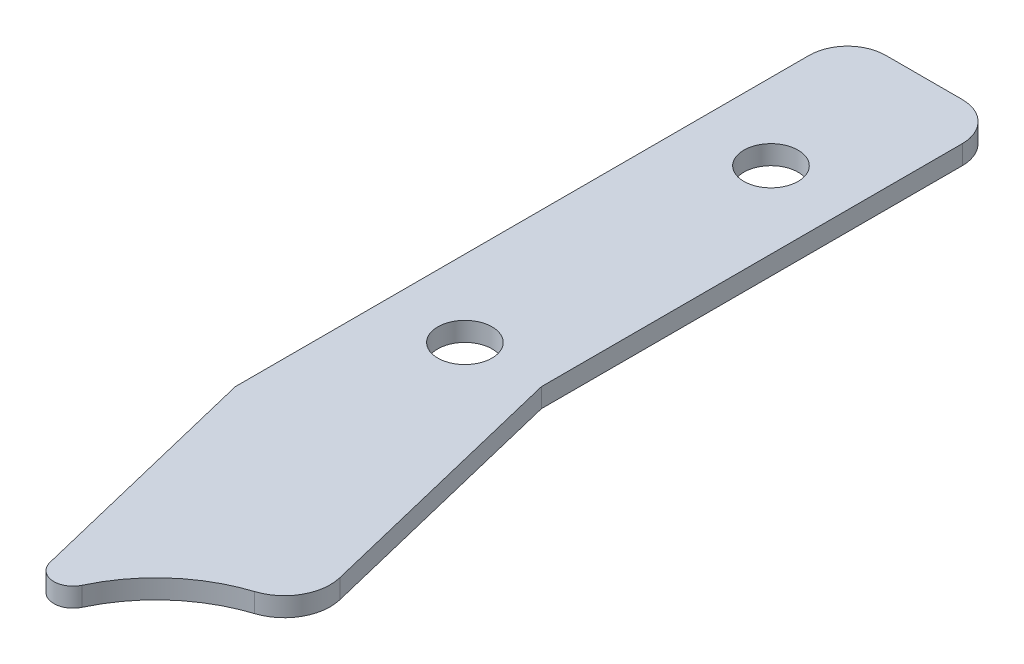
ISO-10303-21;
HEADER;
FILE_DESCRIPTION(('STEP AP214'),'2;1');
FILE_NAME('part.step','',(''),(''),'','','');
FILE_SCHEMA(('AUTOMOTIVE_DESIGN { 1 0 10303 214 1 1 1 1 }'));
ENDSEC;
DATA;
#1=APPLICATION_CONTEXT('core data for automotive mechanical design processes');
#2=APPLICATION_PROTOCOL_DEFINITION('international standard','automotive_design',2000,#1);
#3=PRODUCT_CONTEXT('',#1,'mechanical');
#4=PRODUCT('Part','Part','',(#3));
#5=PRODUCT_RELATED_PRODUCT_CATEGORY('part','',(#4));
#6=PRODUCT_DEFINITION_FORMATION('','',#4);
#7=PRODUCT_DEFINITION_CONTEXT('part definition',#1,'design');
#8=PRODUCT_DEFINITION('design','',#6,#7);
#9=PRODUCT_DEFINITION_SHAPE('','',#8);
#10=(LENGTH_UNIT() NAMED_UNIT(*) SI_UNIT(.MILLI.,.METRE.));
#11=(NAMED_UNIT(*) PLANE_ANGLE_UNIT() SI_UNIT($,.RADIAN.));
#12=(NAMED_UNIT(*) SI_UNIT($,.STERADIAN.) SOLID_ANGLE_UNIT());
#13=UNCERTAINTY_MEASURE_WITH_UNIT(LENGTH_MEASURE(1.E-05),#10,'distance_accuracy_value','');
#14=(GEOMETRIC_REPRESENTATION_CONTEXT(3) GLOBAL_UNCERTAINTY_ASSIGNED_CONTEXT((#13)) GLOBAL_UNIT_ASSIGNED_CONTEXT((#10,
#11,#12)) REPRESENTATION_CONTEXT('',''));
#15=CARTESIAN_POINT('',(0.,0.,0.));
#16=DIRECTION('',(0.,0.,1.));
#17=DIRECTION('',(1.,0.,0.));
#18=AXIS2_PLACEMENT_3D('',#15,#16,#17);
#19=CARTESIAN_POINT('',(-232.560065736467,1.5875,56.4897882656069));
#20=DIRECTION('',(-0.971743243518999,0.,0.236040396278211));
#21=DIRECTION('',(0.236040396278211,0.,0.971743243518999));
#22=AXIS2_PLACEMENT_3D('',#19,#20,#21);
#23=PLANE('',#22);
#24=DIRECTION('',(-0.236040396278211,0.,-0.971743243518999));
#25=VECTOR('',#24,1.);
#26=CARTESIAN_POINT('',(-232.560065736467,1.5875,56.4897882656069));
#27=LINE('',#26,#25);
#28=CARTESIAN_POINT('',(-229.439778952757,1.5875,69.3355453805772));
#29=VERTEX_POINT('',#28);
#30=CARTESIAN_POINT('',(-234.808335869759,1.5875,47.233994146971));
#31=VERTEX_POINT('',#30);
#32=EDGE_CURVE('E111',#29,#31,#27,.T.);
#33=ORIENTED_EDGE('',*,*,#32,.F.);
#34=DIRECTION('',(0.,-1.,0.));
#35=VECTOR('',#34,1.);
#36=CARTESIAN_POINT('',(-229.439778952757,1.5875,69.3355453805772));
#37=LINE('',#36,#35);
#38=CARTESIAN_POINT('',(-229.439778952757,0.,69.3355453805772));
#39=VERTEX_POINT('',#38);
#40=EDGE_CURVE('E136',#29,#39,#37,.T.);
#41=ORIENTED_EDGE('',*,*,#40,.T.);
#42=DIRECTION('',(-0.236040396278211,0.,-0.971743243518999));
#43=VECTOR('',#42,1.);
#44=CARTESIAN_POINT('',(-232.560065736467,0.,56.4897882656069));
#45=LINE('',#44,#43);
#46=CARTESIAN_POINT('',(-234.808335869759,0.,47.233994146971));
#47=VERTEX_POINT('',#46);
#48=EDGE_CURVE('E134',#39,#47,#45,.T.);
#49=ORIENTED_EDGE('',*,*,#48,.T.);
#50=DIRECTION('',(0.,-1.,0.));
#51=VECTOR('',#50,1.);
#52=CARTESIAN_POINT('',(-234.808335869759,1.5875,47.233994146971));
#53=LINE('',#52,#51);
#54=EDGE_CURVE('E127',#31,#47,#53,.T.);
#55=ORIENTED_EDGE('',*,*,#54,.F.);
#56=EDGE_LOOP('',(#33,#41,#49,#55));
#57=FACE_BOUND('',#56,.T.);
#58=ADVANCED_FACE('F35',(#57),#23,.F.);
#59=CARTESIAN_POINT('',(-234.808335869759,1.5875,0.));
#60=DIRECTION('',(-1.,0.,0.));
#61=DIRECTION('',(0.,0.,1.));
#62=AXIS2_PLACEMENT_3D('',#59,#60,#61);
#63=PLANE('',#62);
#64=DIRECTION('',(0.,0.,-1.));
#65=VECTOR('',#64,1.);
#66=CARTESIAN_POINT('',(-234.808335869759,0.,0.));
#67=LINE('',#66,#65);
#68=CARTESIAN_POINT('',(-234.808335869759,0.,12.3089941469709));
#69=VERTEX_POINT('',#68);
#70=EDGE_CURVE('E230',#47,#69,#67,.T.);
#71=ORIENTED_EDGE('',*,*,#70,.T.);
#72=DIRECTION('',(0.,-1.,0.));
#73=VECTOR('',#72,1.);
#74=CARTESIAN_POINT('',(-234.808335869759,1.5875,12.3089941469709));
#75=LINE('',#74,#73);
#76=CARTESIAN_POINT('',(-234.808335869759,1.5875,12.3089941469709));
#77=VERTEX_POINT('',#76);
#78=EDGE_CURVE('E129',#77,#69,#75,.T.);
#79=ORIENTED_EDGE('',*,*,#78,.F.);
#80=DIRECTION('',(0.,0.,-1.));
#81=VECTOR('',#80,1.);
#82=CARTESIAN_POINT('',(-234.808335869759,1.5875,0.));
#83=LINE('',#82,#81);
#84=EDGE_CURVE('E114',#31,#77,#83,.T.);
#85=ORIENTED_EDGE('',*,*,#84,.F.);
#86=ORIENTED_EDGE('',*,*,#54,.T.);
#87=EDGE_LOOP('',(#71,#79,#85,#86));
#88=FACE_BOUND('',#87,.T.);
#89=ADVANCED_FACE('F126',(#88),#63,.F.);
#90=CARTESIAN_POINT('',(-237.983335869759,1.5875,12.3089941469709));
#91=DIRECTION('',(0.,-1.,0.));
#92=DIRECTION('',(0.,0.,-1.));
#93=AXIS2_PLACEMENT_3D('',#90,#91,#92);
#94=CYLINDRICAL_SURFACE('',#93,3.17499999999999);
#95=CARTESIAN_POINT('',(-237.983335869759,0.,12.3089941469709));
#96=DIRECTION('',(0.,1.,0.));
#97=DIRECTION('',(0.,0.,1.));
#98=AXIS2_PLACEMENT_3D('',#95,#96,#97);
#99=CIRCLE('',#98,3.17499999999999);
#100=CARTESIAN_POINT('',(-237.983335869759,0.,9.13399414697094));
#101=VERTEX_POINT('',#100);
#102=EDGE_CURVE('E231',#69,#101,#99,.T.);
#103=ORIENTED_EDGE('',*,*,#102,.T.);
#104=DIRECTION('',(0.,-1.,0.));
#105=VECTOR('',#104,1.);
#106=CARTESIAN_POINT('',(-237.983335869759,1.5875,9.13399414697094));
#107=LINE('',#106,#105);
#108=CARTESIAN_POINT('',(-237.983335869759,1.5875,9.13399414697094));
#109=VERTEX_POINT('',#108);
#110=EDGE_CURVE('E140',#109,#101,#107,.T.);
#111=ORIENTED_EDGE('',*,*,#110,.F.);
#112=CARTESIAN_POINT('',(-237.983335869759,1.5875,12.3089941469709));
#113=DIRECTION('',(0.,1.,0.));
#114=DIRECTION('',(0.,0.,1.));
#115=AXIS2_PLACEMENT_3D('',#112,#113,#114);
#116=CIRCLE('',#115,3.17499999999999);
#117=EDGE_CURVE('E131',#77,#109,#116,.T.);
#118=ORIENTED_EDGE('',*,*,#117,.F.);
#119=ORIENTED_EDGE('',*,*,#78,.T.);
#120=EDGE_LOOP('',(#103,#111,#118,#119));
#121=FACE_BOUND('',#120,.T.);
#122=ADVANCED_FACE('F210',(#121),#94,.T.);
#123=CARTESIAN_POINT('',(0.,1.5875,9.13399414697113));
#124=DIRECTION('',(0.,0.,1.));
#125=DIRECTION('',(1.,0.,0.));
#126=AXIS2_PLACEMENT_3D('',#123,#124,#125);
#127=PLANE('',#126);
#128=DIRECTION('',(-1.,0.,0.));
#129=VECTOR('',#128,1.);
#130=CARTESIAN_POINT('',(0.,0.,9.13399414697113));
#131=LINE('',#130,#129);
#132=CARTESIAN_POINT('',(-244.333335869759,0.,9.13399414697093));
#133=VERTEX_POINT('',#132);
#134=EDGE_CURVE('E232',#101,#133,#131,.T.);
#135=ORIENTED_EDGE('',*,*,#134,.T.);
#136=DIRECTION('',(0.,-1.,0.));
#137=VECTOR('',#136,1.);
#138=CARTESIAN_POINT('',(-244.333335869759,1.5875,9.13399414697093));
#139=LINE('',#138,#137);
#140=CARTESIAN_POINT('',(-244.333335869759,1.5875,9.13399414697093));
#141=VERTEX_POINT('',#140);
#142=EDGE_CURVE('E254',#141,#133,#139,.T.);
#143=ORIENTED_EDGE('',*,*,#142,.F.);
#144=DIRECTION('',(-1.,0.,0.));
#145=VECTOR('',#144,1.);
#146=CARTESIAN_POINT('',(0.,1.5875,9.13399414697113));
#147=LINE('',#146,#145);
#148=EDGE_CURVE('E169',#109,#141,#147,.T.);
#149=ORIENTED_EDGE('',*,*,#148,.F.);
#150=ORIENTED_EDGE('',*,*,#110,.T.);
#151=EDGE_LOOP('',(#135,#143,#149,#150));
#152=FACE_BOUND('',#151,.T.);
#153=ADVANCED_FACE('F206',(#152),#127,.F.);
#154=CARTESIAN_POINT('',(-244.333335869759,1.5875,12.3089941469709));
#155=DIRECTION('',(0.,-1.,0.));
#156=DIRECTION('',(0.,0.,-1.));
#157=AXIS2_PLACEMENT_3D('',#154,#155,#156);
#158=CYLINDRICAL_SURFACE('',#157,3.17500000000001);
#159=CARTESIAN_POINT('',(-244.333335869759,0.,12.3089941469709));
#160=DIRECTION('',(0.,1.,0.));
#161=DIRECTION('',(0.,0.,1.));
#162=AXIS2_PLACEMENT_3D('',#159,#160,#161);
#163=CIRCLE('',#162,3.17500000000001);
#164=CARTESIAN_POINT('',(-247.508335869759,0.,12.3089941469709));
#165=VERTEX_POINT('',#164);
#166=EDGE_CURVE('E236',#133,#165,#163,.T.);
#167=ORIENTED_EDGE('',*,*,#166,.T.);
#168=DIRECTION('',(0.,-1.,0.));
#169=VECTOR('',#168,1.);
#170=CARTESIAN_POINT('',(-247.508335869759,1.5875,12.3089941469709));
#171=LINE('',#170,#169);
#172=CARTESIAN_POINT('',(-247.508335869759,1.5875,12.3089941469709));
#173=VERTEX_POINT('',#172);
#174=EDGE_CURVE('E251',#173,#165,#171,.T.);
#175=ORIENTED_EDGE('',*,*,#174,.F.);
#176=CARTESIAN_POINT('',(-244.333335869759,1.5875,12.3089941469709));
#177=DIRECTION('',(0.,1.,0.));
#178=DIRECTION('',(0.,0.,1.));
#179=AXIS2_PLACEMENT_3D('',#176,#177,#178);
#180=CIRCLE('',#179,3.17500000000001);
#181=EDGE_CURVE('E171',#141,#173,#180,.T.);
#182=ORIENTED_EDGE('',*,*,#181,.F.);
#183=ORIENTED_EDGE('',*,*,#142,.T.);
#184=EDGE_LOOP('',(#167,#175,#182,#183));
#185=FACE_BOUND('',#184,.T.);
#186=ADVANCED_FACE('F202',(#185),#158,.T.);
#187=CARTESIAN_POINT('',(-247.508335869759,1.5875,0.));
#188=DIRECTION('',(1.,0.,0.));
#189=DIRECTION('',(0.,0.,-1.));
#190=AXIS2_PLACEMENT_3D('',#187,#188,#189);
#191=PLANE('',#190);
#192=DIRECTION('',(0.,0.,1.));
#193=VECTOR('',#192,1.);
#194=CARTESIAN_POINT('',(-247.508335869759,0.,0.));
#195=LINE('',#194,#193);
#196=CARTESIAN_POINT('',(-247.508335869759,0.,59.933994146971));
#197=VERTEX_POINT('',#196);
#198=EDGE_CURVE('E238',#165,#197,#195,.T.);
#199=ORIENTED_EDGE('',*,*,#198,.T.);
#200=DIRECTION('',(0.,-1.,0.));
#201=VECTOR('',#200,1.);
#202=CARTESIAN_POINT('',(-247.508335869759,1.5875,59.933994146971));
#203=LINE('',#202,#201);
#204=CARTESIAN_POINT('',(-247.508335869759,1.5875,59.933994146971));
#205=VERTEX_POINT('',#204);
#206=EDGE_CURVE('E183',#205,#197,#203,.T.);
#207=ORIENTED_EDGE('',*,*,#206,.F.);
#208=DIRECTION('',(0.,0.,1.));
#209=VECTOR('',#208,1.);
#210=CARTESIAN_POINT('',(-247.508335869759,1.5875,0.));
#211=LINE('',#210,#209);
#212=EDGE_CURVE('E173',#173,#205,#211,.T.);
#213=ORIENTED_EDGE('',*,*,#212,.F.);
#214=ORIENTED_EDGE('',*,*,#174,.T.);
#215=EDGE_LOOP('',(#199,#207,#213,#214));
#216=FACE_BOUND('',#215,.T.);
#217=ADVANCED_FACE('F199',(#216),#191,.F.);
#218=CARTESIAN_POINT('',(-247.465491749859,1.5875,60.1103770233491));
#219=DIRECTION('',(-0.971743243518999,0.,0.236040396278211));
#220=DIRECTION('',(0.236040396278211,0.,0.971743243518999));
#221=AXIS2_PLACEMENT_3D('',#218,#219,#220);
#222=PLANE('',#221);
#223=DIRECTION('',(-0.236040396278211,0.,-0.971743243518999));
#224=VECTOR('',#223,1.);
#225=CARTESIAN_POINT('',(-247.465491749859,0.,60.1103770233491));
#226=LINE('',#225,#224);
#227=CARTESIAN_POINT('',(-242.570138878491,0.,80.2638175038802));
#228=VERTEX_POINT('',#227);
#229=EDGE_CURVE('E241',#228,#197,#226,.T.);
#230=ORIENTED_EDGE('',*,*,#229,.F.);
#231=DIRECTION('',(0.,1.,0.));
#232=VECTOR('',#231,1.);
#233=CARTESIAN_POINT('',(-242.570138878491,1.5875,80.2638175038802));
#234=LINE('',#233,#232);
#235=CARTESIAN_POINT('',(-242.570138878491,1.5875,80.2638175038802));
#236=VERTEX_POINT('',#235);
#237=EDGE_CURVE('E44',#228,#236,#234,.T.);
#238=ORIENTED_EDGE('',*,*,#237,.T.);
#239=DIRECTION('',(-0.236040396278211,0.,-0.971743243518999));
#240=VECTOR('',#239,1.);
#241=CARTESIAN_POINT('',(-247.465491749859,1.5875,60.1103770233491));
#242=LINE('',#241,#240);
#243=EDGE_CURVE('E176',#236,#205,#242,.T.);
#244=ORIENTED_EDGE('',*,*,#243,.T.);
#245=ORIENTED_EDGE('',*,*,#206,.T.);
#246=EDGE_LOOP('',(#230,#238,#244,#245));
#247=FACE_BOUND('',#246,.T.);
#248=ADVANCED_FACE('F193',(#247),#222,.T.);
#249=CARTESIAN_POINT('',(-225.882881073085,1.5875,98.6041209695369));
#250=CARTESIAN_POINT('',(-250.896997999595,1.5875,103.014784682277));
#251=CARTESIAN_POINT('',(-255.331930488417,1.5875,77.8630326871912));
#252=CARTESIAN_POINT('',(-230.317813561907,1.5875,73.452368974451));
#253=CARTESIAN_POINT('',(-205.303696635397,1.5875,69.0417052617107));
#254=CARTESIAN_POINT('',(-200.868764146575,1.5875,94.1934572567967));
#255=CARTESIAN_POINT('',(-225.882881073085,1.5875,98.6041209695369));
#256=(BOUNDED_CURVE() B_SPLINE_CURVE(3,(#249,#250,#251,#252,#253,#254,#255),.UNSPECIFIED.,.T.,
.F.) B_SPLINE_CURVE_WITH_KNOTS((4,3,4),(0.,0.5,1.),
.UNSPECIFIED.) CURVE() GEOMETRIC_REPRESENTATION_ITEM() RATIONAL_B_SPLINE_CURVE((1.,
0.333333333333333,0.333333333333333,1.,0.333333333333333,0.333333333333333,1.)) REPRESENTATION_ITEM(''));
#257=DIRECTION('',(0.,-1.,0.));
#258=VECTOR('',#257,1.);
#259=SURFACE_OF_LINEAR_EXTRUSION('',#256,#258);
#260=CARTESIAN_POINT('',(-239.590371490527,1.5875,80.5635127581352));
#261=VERTEX_POINT('',#260);
#262=CARTESIAN_POINT('',(-231.979363234665,1.5875,73.8630950947847));
#263=VERTEX_POINT('',#262);
#264=EDGE_CURVE('E178',#261,#263,#256,.T.);
#265=ORIENTED_EDGE('',*,*,#264,.F.);
#266=DIRECTION('',(0.,-1.,0.));
#267=VECTOR('',#266,1.);
#268=CARTESIAN_POINT('',(-239.590371490523,1.5875,80.5635127581256));
#269=LINE('',#268,#267);
#270=CARTESIAN_POINT('',(-239.590371490523,0.,80.5635127581255));
#271=VERTEX_POINT('',#270);
#272=EDGE_CURVE('E150',#261,#271,#269,.T.);
#273=ORIENTED_EDGE('',*,*,#272,.T.);
#274=CARTESIAN_POINT('',(-225.882881073085,0.,98.6041209695369));
#275=CARTESIAN_POINT('',(-250.896997999595,0.,103.014784682277));
#276=CARTESIAN_POINT('',(-255.331930488417,0.,77.8630326871912));
#277=CARTESIAN_POINT('',(-230.317813561907,0.,73.452368974451));
#278=CARTESIAN_POINT('',(-205.303696635397,0.,69.0417052617107));
#279=CARTESIAN_POINT('',(-200.868764146575,0.,94.1934572567967));
#280=CARTESIAN_POINT('',(-225.882881073085,0.,98.6041209695369));
#281=(BOUNDED_CURVE() B_SPLINE_CURVE(3,(#274,#275,#276,#277,#278,#279,#280),.UNSPECIFIED.,.T.,
.F.) B_SPLINE_CURVE_WITH_KNOTS((4,3,4),(0.,0.5,1.),
.UNSPECIFIED.) CURVE() GEOMETRIC_REPRESENTATION_ITEM() RATIONAL_B_SPLINE_CURVE((1.,
0.333333333333333,0.333333333333333,1.,0.333333333333333,0.333333333333333,1.)) REPRESENTATION_ITEM(''));
#282=CARTESIAN_POINT('',(-231.979363234665,0.,73.8630950947847));
#283=VERTEX_POINT('',#282);
#284=EDGE_CURVE('E122',#271,#283,#281,.T.);
#285=ORIENTED_EDGE('',*,*,#284,.T.);
#286=DIRECTION('',(0.,-1.,0.));
#287=VECTOR('',#286,1.);
#288=CARTESIAN_POINT('',(-231.979363234663,0.,73.863095094784));
#289=LINE('',#288,#287);
#290=EDGE_CURVE('E146',#283,#263,#289,.F.);
#291=ORIENTED_EDGE('',*,*,#290,.T.);
#292=EDGE_LOOP('',(#265,#273,#285,#291));
#293=FACE_BOUND('',#292,.T.);
#294=ADVANCED_FACE('F189',(#293),#259,.F.);
#295=CARTESIAN_POINT('',(0.,1.5875,0.));
#296=DIRECTION('',(0.,1.,0.));
#297=DIRECTION('',(0.,0.,1.));
#298=AXIS2_PLACEMENT_3D('',#295,#296,#297);
#299=PLANE('',#298);
#300=CARTESIAN_POINT('',(-241.158335869759,1.5875,21.833994146971));
#301=DIRECTION('',(0.,1.,0.));
#302=DIRECTION('',(0.,0.,1.));
#303=AXIS2_PLACEMENT_3D('',#300,#301,#302);
#304=CIRCLE('',#303,2.25000000000001);
#305=CARTESIAN_POINT('',(-241.158335869759,1.5875,24.083994146971));
#306=VERTEX_POINT('',#305);
#307=EDGE_CURVE('E156',#306,#306,#304,.T.);
#308=ORIENTED_EDGE('',*,*,#307,.F.);
#309=EDGE_LOOP('',(#308));
#310=FACE_BOUND('',#309,.T.);
#311=CARTESIAN_POINT('',(-241.158335869759,1.5875,47.233994146971));
#312=DIRECTION('',(0.,1.,0.));
#313=DIRECTION('',(0.,0.,1.));
#314=AXIS2_PLACEMENT_3D('',#311,#312,#313);
#315=CIRCLE('',#314,2.25000000000001);
#316=CARTESIAN_POINT('',(-241.158335869759,1.5875,49.483994146971));
#317=VERTEX_POINT('',#316);
#318=EDGE_CURVE('E161',#317,#317,#315,.T.);
#319=ORIENTED_EDGE('',*,*,#318,.F.);
#320=EDGE_LOOP('',(#319));
#321=FACE_BOUND('',#320,.T.);
#322=ORIENTED_EDGE('',*,*,#243,.F.);
#323=CARTESIAN_POINT('',(-241.027496479404,1.5875,79.8891033747886));
#324=DIRECTION('',(0.,1.,0.));
#325=DIRECTION('',(0.,0.,1.));
#326=AXIS2_PLACEMENT_3D('',#323,#324,#325);
#327=CIRCLE('',#326,1.5875);
#328=EDGE_CURVE('E11',#236,#261,#327,.T.);
#329=ORIENTED_EDGE('',*,*,#328,.T.);
#330=ORIENTED_EDGE('',*,*,#264,.T.);
#331=CARTESIAN_POINT('',(-233.142120710565,1.5875,70.2348592903972));
#332=DIRECTION('',(0.,1.,0.));
#333=DIRECTION('',(0.,0.,1.));
#334=AXIS2_PLACEMENT_3D('',#331,#332,#333);
#335=CIRCLE('',#334,3.81);
#336=EDGE_CURVE('E117',#263,#29,#335,.T.);
#337=ORIENTED_EDGE('',*,*,#336,.T.);
#338=ORIENTED_EDGE('',*,*,#32,.T.);
#339=ORIENTED_EDGE('',*,*,#84,.T.);
#340=ORIENTED_EDGE('',*,*,#117,.T.);
#341=ORIENTED_EDGE('',*,*,#148,.T.);
#342=ORIENTED_EDGE('',*,*,#181,.T.);
#343=ORIENTED_EDGE('',*,*,#212,.T.);
#344=EDGE_LOOP('',(#322,#329,#330,#337,#338,#339,#340,#341,#342,#343));
#345=FACE_BOUND('',#344,.T.);
#346=ADVANCED_FACE('F113',(#310,#321,#345),#299,.T.);
#347=CARTESIAN_POINT('',(0.,0.,0.));
#348=DIRECTION('',(0.,1.,0.));
#349=DIRECTION('',(0.,0.,1.));
#350=AXIS2_PLACEMENT_3D('',#347,#348,#349);
#351=PLANE('',#350);
#352=CARTESIAN_POINT('',(-241.158335869759,0.,21.833994146971));
#353=DIRECTION('',(0.,1.,0.));
#354=DIRECTION('',(0.,0.,1.));
#355=AXIS2_PLACEMENT_3D('',#352,#353,#354);
#356=CIRCLE('',#355,2.25000000000001);
#357=CARTESIAN_POINT('',(-241.158335869759,0.,24.083994146971));
#358=VERTEX_POINT('',#357);
#359=EDGE_CURVE('E39',#358,#358,#356,.T.);
#360=ORIENTED_EDGE('',*,*,#359,.T.);
#361=EDGE_LOOP('',(#360));
#362=FACE_BOUND('',#361,.T.);
#363=CARTESIAN_POINT('',(-241.158335869759,0.,47.233994146971));
#364=DIRECTION('',(0.,1.,0.));
#365=DIRECTION('',(0.,0.,1.));
#366=AXIS2_PLACEMENT_3D('',#363,#364,#365);
#367=CIRCLE('',#366,2.25000000000001);
#368=CARTESIAN_POINT('',(-241.158335869759,0.,49.483994146971));
#369=VERTEX_POINT('',#368);
#370=EDGE_CURVE('E154',#369,#369,#367,.T.);
#371=ORIENTED_EDGE('',*,*,#370,.T.);
#372=EDGE_LOOP('',(#371));
#373=FACE_BOUND('',#372,.T.);
#374=ORIENTED_EDGE('',*,*,#284,.F.);
#375=CARTESIAN_POINT('',(-241.027496479404,0.,79.8891033747886));
#376=DIRECTION('',(0.,1.,0.));
#377=DIRECTION('',(0.,0.,1.));
#378=AXIS2_PLACEMENT_3D('',#375,#376,#377);
#379=CIRCLE('',#378,1.5875);
#380=EDGE_CURVE('E59',#271,#228,#379,.F.);
#381=ORIENTED_EDGE('',*,*,#380,.T.);
#382=ORIENTED_EDGE('',*,*,#229,.T.);
#383=ORIENTED_EDGE('',*,*,#198,.F.);
#384=ORIENTED_EDGE('',*,*,#166,.F.);
#385=ORIENTED_EDGE('',*,*,#134,.F.);
#386=ORIENTED_EDGE('',*,*,#102,.F.);
#387=ORIENTED_EDGE('',*,*,#70,.F.);
#388=ORIENTED_EDGE('',*,*,#48,.F.);
#389=CARTESIAN_POINT('',(-233.142120710565,0.,70.2348592903972));
#390=DIRECTION('',(0.,1.,0.));
#391=DIRECTION('',(0.,0.,1.));
#392=AXIS2_PLACEMENT_3D('',#389,#390,#391);
#393=CIRCLE('',#392,3.81);
#394=EDGE_CURVE('E138',#39,#283,#393,.F.);
#395=ORIENTED_EDGE('',*,*,#394,.T.);
#396=EDGE_LOOP('',(#374,#381,#382,#383,#384,#385,#386,#387,#388,#395));
#397=FACE_BOUND('',#396,.T.);
#398=ADVANCED_FACE('F195',(#362,#373,#397),#351,.F.);
#399=CARTESIAN_POINT('',(-233.142120710565,0.79375,70.2348592903972));
#400=DIRECTION('',(0.,-1.,0.));
#401=DIRECTION('',(0.,0.,-1.));
#402=AXIS2_PLACEMENT_3D('',#399,#400,#401);
#403=CYLINDRICAL_SURFACE('',#402,3.81);
#404=ORIENTED_EDGE('',*,*,#336,.F.);
#405=ORIENTED_EDGE('',*,*,#290,.F.);
#406=ORIENTED_EDGE('',*,*,#394,.F.);
#407=ORIENTED_EDGE('',*,*,#40,.F.);
#408=EDGE_LOOP('',(#404,#405,#406,#407));
#409=FACE_BOUND('',#408,.T.);
#410=ADVANCED_FACE('F218',(#409),#403,.T.);
#411=CARTESIAN_POINT('',(-241.027496479404,0.79375,79.8891033747886));
#412=DIRECTION('',(0.,-1.,0.));
#413=DIRECTION('',(0.,0.,-1.));
#414=AXIS2_PLACEMENT_3D('',#411,#412,#413);
#415=CYLINDRICAL_SURFACE('',#414,1.5875);
#416=ORIENTED_EDGE('',*,*,#328,.F.);
#417=ORIENTED_EDGE('',*,*,#237,.F.);
#418=ORIENTED_EDGE('',*,*,#380,.F.);
#419=ORIENTED_EDGE('',*,*,#272,.F.);
#420=EDGE_LOOP('',(#416,#417,#418,#419));
#421=FACE_BOUND('',#420,.T.);
#422=ADVANCED_FACE('F37',(#421),#415,.T.);
#423=CARTESIAN_POINT('',(-241.158335869759,-1.5875,47.233994146971));
#424=DIRECTION('',(0.,1.,0.));
#425=DIRECTION('',(0.,0.,1.));
#426=AXIS2_PLACEMENT_3D('',#423,#424,#425);
#427=CYLINDRICAL_SURFACE('',#426,2.25000000000001);
#428=ORIENTED_EDGE('',*,*,#318,.T.);
#429=EDGE_LOOP('',(#428));
#430=FACE_BOUND('',#429,.T.);
#431=ORIENTED_EDGE('',*,*,#370,.F.);
#432=EDGE_LOOP('',(#431));
#433=FACE_BOUND('',#432,.T.);
#434=ADVANCED_FACE('F225',(#430,#433),#427,.F.);
#435=CARTESIAN_POINT('',(-241.158335869759,-1.5875,21.833994146971));
#436=DIRECTION('',(0.,1.,0.));
#437=DIRECTION('',(0.,0.,1.));
#438=AXIS2_PLACEMENT_3D('',#435,#436,#437);
#439=CYLINDRICAL_SURFACE('',#438,2.25000000000001);
#440=ORIENTED_EDGE('',*,*,#307,.T.);
#441=EDGE_LOOP('',(#440));
#442=FACE_BOUND('',#441,.T.);
#443=ORIENTED_EDGE('',*,*,#359,.F.);
#444=EDGE_LOOP('',(#443));
#445=FACE_BOUND('',#444,.T.);
#446=ADVANCED_FACE('F276',(#442,#445),#439,.F.);
#447=CLOSED_SHELL('',(#58,#89,#122,#153,#186,#217,#248,#294,#346,#398,#410,#422,#434,#446));
#448=MANIFOLD_SOLID_BREP('B2',#447);
#449=ADVANCED_BREP_SHAPE_REPRESENTATION('',(#18,#448),#14);
#450=SHAPE_DEFINITION_REPRESENTATION(#9,#449);
ENDSEC;
END-ISO-10303-21;
